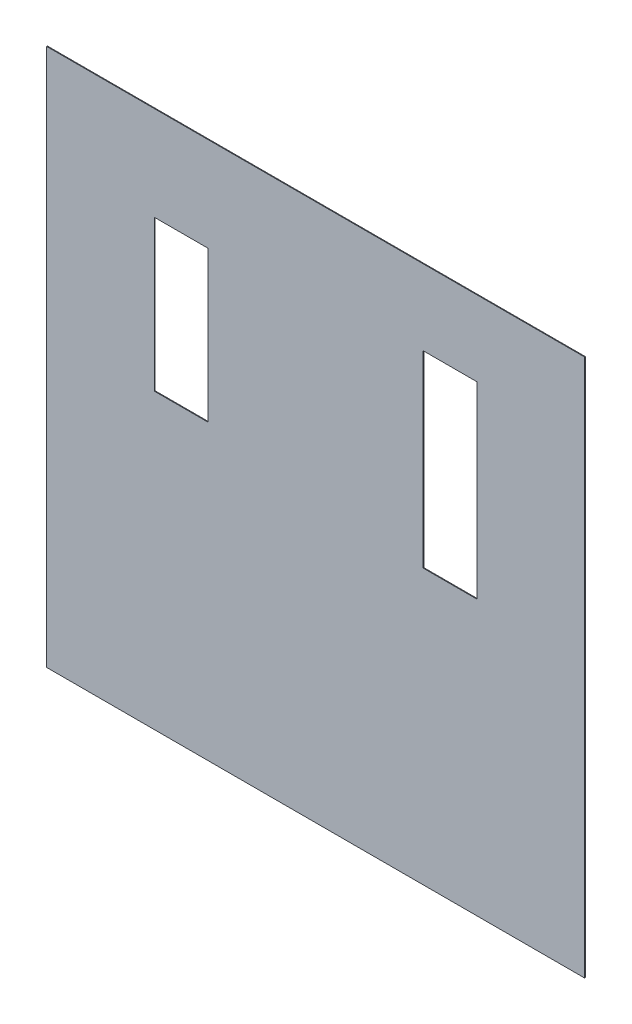
ISO-10303-21;
HEADER;
FILE_DESCRIPTION(('STEP AP214'),'2;1');
FILE_NAME('part.step','',(''),(''),'','','');
FILE_SCHEMA(('AUTOMOTIVE_DESIGN { 1 0 10303 214 1 1 1 1 }'));
ENDSEC;
DATA;
#1=APPLICATION_CONTEXT('core data for automotive mechanical design processes');
#2=APPLICATION_PROTOCOL_DEFINITION('international standard','automotive_design',2000,#1);
#3=PRODUCT_CONTEXT('',#1,'mechanical');
#4=PRODUCT('Part','Part','',(#3));
#5=PRODUCT_RELATED_PRODUCT_CATEGORY('part','',(#4));
#6=PRODUCT_DEFINITION_FORMATION('','',#4);
#7=PRODUCT_DEFINITION_CONTEXT('part definition',#1,'design');
#8=PRODUCT_DEFINITION('design','',#6,#7);
#9=PRODUCT_DEFINITION_SHAPE('','',#8);
#10=(LENGTH_UNIT() NAMED_UNIT(*) SI_UNIT(.MILLI.,.METRE.));
#11=(NAMED_UNIT(*) PLANE_ANGLE_UNIT() SI_UNIT($,.RADIAN.));
#12=(NAMED_UNIT(*) SI_UNIT($,.STERADIAN.) SOLID_ANGLE_UNIT());
#13=UNCERTAINTY_MEASURE_WITH_UNIT(LENGTH_MEASURE(1.E-05),#10,'distance_accuracy_value','');
#14=(GEOMETRIC_REPRESENTATION_CONTEXT(3) GLOBAL_UNCERTAINTY_ASSIGNED_CONTEXT((#13)) GLOBAL_UNIT_ASSIGNED_CONTEXT((#10,
#11,#12)) REPRESENTATION_CONTEXT('',''));
#15=CARTESIAN_POINT('',(0.,0.,0.));
#16=DIRECTION('',(0.,0.,1.));
#17=DIRECTION('',(1.,0.,0.));
#18=AXIS2_PLACEMENT_3D('',#15,#16,#17);
#19=CARTESIAN_POINT('',(0.,0.,0.03556));
#20=DIRECTION('',(1.,0.,0.));
#21=DIRECTION('',(0.,0.,-1.));
#22=AXIS2_PLACEMENT_3D('',#19,#20,#21);
#23=PLANE('',#22);
#24=DIRECTION('',(0.,-1.,0.));
#25=VECTOR('',#24,1.);
#26=CARTESIAN_POINT('',(0.,0.,0.));
#27=LINE('',#26,#25);
#28=CARTESIAN_POINT('',(0.,25.4,0.));
#29=VERTEX_POINT('',#28);
#30=CARTESIAN_POINT('',(0.,0.,0.));
#31=VERTEX_POINT('',#30);
#32=EDGE_CURVE('E183',#29,#31,#27,.T.);
#33=ORIENTED_EDGE('',*,*,#32,.T.);
#34=DIRECTION('',(0.,0.,-1.));
#35=VECTOR('',#34,1.);
#36=CARTESIAN_POINT('',(0.,0.,0.03556));
#37=LINE('',#36,#35);
#38=CARTESIAN_POINT('',(0.,0.,0.03556));
#39=VERTEX_POINT('',#38);
#40=EDGE_CURVE('E11',#39,#31,#37,.T.);
#41=ORIENTED_EDGE('',*,*,#40,.F.);
#42=DIRECTION('',(0.,-1.,0.));
#43=VECTOR('',#42,1.);
#44=CARTESIAN_POINT('',(0.,0.,0.03556));
#45=LINE('',#44,#43);
#46=CARTESIAN_POINT('',(0.,25.4,0.03556));
#47=VERTEX_POINT('',#46);
#48=EDGE_CURVE('E190',#47,#39,#45,.T.);
#49=ORIENTED_EDGE('',*,*,#48,.F.);
#50=DIRECTION('',(0.,0.,-1.));
#51=VECTOR('',#50,1.);
#52=CARTESIAN_POINT('',(0.,25.4,0.03556));
#53=LINE('',#52,#51);
#54=EDGE_CURVE('E200',#47,#29,#53,.T.);
#55=ORIENTED_EDGE('',*,*,#54,.T.);
#56=EDGE_LOOP('',(#33,#41,#49,#55));
#57=FACE_BOUND('',#56,.T.);
#58=ADVANCED_FACE('F33',(#57),#23,.F.);
#59=CARTESIAN_POINT('',(0.,0.,0.03556));
#60=DIRECTION('',(0.,1.,0.));
#61=DIRECTION('',(0.,0.,1.));
#62=AXIS2_PLACEMENT_3D('',#59,#60,#61);
#63=PLANE('',#62);
#64=DIRECTION('',(1.,0.,0.));
#65=VECTOR('',#64,1.);
#66=CARTESIAN_POINT('',(0.,0.,0.));
#67=LINE('',#66,#65);
#68=CARTESIAN_POINT('',(25.4,0.,0.));
#69=VERTEX_POINT('',#68);
#70=EDGE_CURVE('E203',#31,#69,#67,.T.);
#71=ORIENTED_EDGE('',*,*,#70,.T.);
#72=DIRECTION('',(0.,0.,-1.));
#73=VECTOR('',#72,1.);
#74=CARTESIAN_POINT('',(25.4,0.,0.03556));
#75=LINE('',#74,#73);
#76=CARTESIAN_POINT('',(25.4,0.,0.03556));
#77=VERTEX_POINT('',#76);
#78=EDGE_CURVE('E40',#77,#69,#75,.T.);
#79=ORIENTED_EDGE('',*,*,#78,.F.);
#80=DIRECTION('',(1.,0.,0.));
#81=VECTOR('',#80,1.);
#82=CARTESIAN_POINT('',(0.,0.,0.03556));
#83=LINE('',#82,#81);
#84=EDGE_CURVE('E193',#39,#77,#83,.T.);
#85=ORIENTED_EDGE('',*,*,#84,.F.);
#86=ORIENTED_EDGE('',*,*,#40,.T.);
#87=EDGE_LOOP('',(#71,#79,#85,#86));
#88=FACE_BOUND('',#87,.T.);
#89=ADVANCED_FACE('F232',(#88),#63,.F.);
#90=CARTESIAN_POINT('',(25.4,0.,0.03556));
#91=DIRECTION('',(-1.,0.,0.));
#92=DIRECTION('',(0.,0.,1.));
#93=AXIS2_PLACEMENT_3D('',#90,#91,#92);
#94=PLANE('',#93);
#95=DIRECTION('',(0.,1.,0.));
#96=VECTOR('',#95,1.);
#97=CARTESIAN_POINT('',(25.4,0.,0.));
#98=LINE('',#97,#96);
#99=CARTESIAN_POINT('',(25.4,25.4,0.));
#100=VERTEX_POINT('',#99);
#101=EDGE_CURVE('E205',#69,#100,#98,.T.);
#102=ORIENTED_EDGE('',*,*,#101,.T.);
#103=DIRECTION('',(0.,0.,-1.));
#104=VECTOR('',#103,1.);
#105=CARTESIAN_POINT('',(25.4,25.4,0.03556));
#106=LINE('',#105,#104);
#107=CARTESIAN_POINT('',(25.4,25.4,0.03556));
#108=VERTEX_POINT('',#107);
#109=EDGE_CURVE('E210',#108,#100,#106,.T.);
#110=ORIENTED_EDGE('',*,*,#109,.F.);
#111=DIRECTION('',(0.,1.,0.));
#112=VECTOR('',#111,1.);
#113=CARTESIAN_POINT('',(25.4,0.,0.03556));
#114=LINE('',#113,#112);
#115=EDGE_CURVE('E196',#77,#108,#114,.T.);
#116=ORIENTED_EDGE('',*,*,#115,.F.);
#117=ORIENTED_EDGE('',*,*,#78,.T.);
#118=EDGE_LOOP('',(#102,#110,#116,#117));
#119=FACE_BOUND('',#118,.T.);
#120=ADVANCED_FACE('F217',(#119),#94,.F.);
#121=CARTESIAN_POINT('',(0.,25.4,0.03556));
#122=DIRECTION('',(0.,-1.,0.));
#123=DIRECTION('',(0.,0.,-1.));
#124=AXIS2_PLACEMENT_3D('',#121,#122,#123);
#125=PLANE('',#124);
#126=DIRECTION('',(-1.,0.,0.));
#127=VECTOR('',#126,1.);
#128=CARTESIAN_POINT('',(0.,25.4,0.));
#129=LINE('',#128,#127);
#130=EDGE_CURVE('E194',#100,#29,#129,.T.);
#131=ORIENTED_EDGE('',*,*,#130,.T.);
#132=ORIENTED_EDGE('',*,*,#54,.F.);
#133=DIRECTION('',(-1.,0.,0.));
#134=VECTOR('',#133,1.);
#135=CARTESIAN_POINT('',(0.,25.4,0.03556));
#136=LINE('',#135,#134);
#137=EDGE_CURVE('E198',#108,#47,#136,.T.);
#138=ORIENTED_EDGE('',*,*,#137,.F.);
#139=ORIENTED_EDGE('',*,*,#109,.T.);
#140=EDGE_LOOP('',(#131,#132,#138,#139));
#141=FACE_BOUND('',#140,.T.);
#142=ADVANCED_FACE('F225',(#141),#125,.F.);
#143=CARTESIAN_POINT('',(0.,0.,0.03556));
#144=DIRECTION('',(0.,0.,-1.));
#145=DIRECTION('',(-1.,0.,0.));
#146=AXIS2_PLACEMENT_3D('',#143,#144,#145);
#147=PLANE('',#146);
#148=DIRECTION('',(1.,0.,0.));
#149=VECTOR('',#148,1.);
#150=CARTESIAN_POINT('',(17.78,12.954,0.03556));
#151=LINE('',#150,#149);
#152=CARTESIAN_POINT('',(17.78,12.954,0.03556));
#153=VERTEX_POINT('',#152);
#154=CARTESIAN_POINT('',(20.32,12.954,0.03556));
#155=VERTEX_POINT('',#154);
#156=EDGE_CURVE('E148',#153,#155,#151,.T.);
#157=ORIENTED_EDGE('',*,*,#156,.F.);
#158=DIRECTION('',(0.,-1.,0.));
#159=VECTOR('',#158,1.);
#160=CARTESIAN_POINT('',(17.78,21.844,0.03556));
#161=LINE('',#160,#159);
#162=CARTESIAN_POINT('',(17.78,21.844,0.03556));
#163=VERTEX_POINT('',#162);
#164=EDGE_CURVE('E47',#163,#153,#161,.T.);
#165=ORIENTED_EDGE('',*,*,#164,.F.);
#166=DIRECTION('',(-1.,0.,0.));
#167=VECTOR('',#166,1.);
#168=CARTESIAN_POINT('',(17.78,21.844,0.03556));
#169=LINE('',#168,#167);
#170=CARTESIAN_POINT('',(20.32,21.844,0.03556));
#171=VERTEX_POINT('',#170);
#172=EDGE_CURVE('E139',#171,#163,#169,.T.);
#173=ORIENTED_EDGE('',*,*,#172,.F.);
#174=DIRECTION('',(0.,1.,0.));
#175=VECTOR('',#174,1.);
#176=CARTESIAN_POINT('',(20.32,21.844,0.03556));
#177=LINE('',#176,#175);
#178=EDGE_CURVE('E142',#155,#171,#177,.T.);
#179=ORIENTED_EDGE('',*,*,#178,.F.);
#180=EDGE_LOOP('',(#157,#165,#173,#179));
#181=FACE_BOUND('',#180,.T.);
#182=DIRECTION('',(1.,0.,0.));
#183=VECTOR('',#182,1.);
#184=CARTESIAN_POINT('',(5.08,13.843,0.03556));
#185=LINE('',#184,#183);
#186=CARTESIAN_POINT('',(5.08,13.843,0.03556));
#187=VERTEX_POINT('',#186);
#188=CARTESIAN_POINT('',(7.62,13.843,0.03556));
#189=VERTEX_POINT('',#188);
#190=EDGE_CURVE('E173',#187,#189,#185,.T.);
#191=ORIENTED_EDGE('',*,*,#190,.F.);
#192=DIRECTION('',(0.,-1.,0.));
#193=VECTOR('',#192,1.);
#194=CARTESIAN_POINT('',(5.08,20.955,0.03556));
#195=LINE('',#194,#193);
#196=CARTESIAN_POINT('',(5.08,20.955,0.03556));
#197=VERTEX_POINT('',#196);
#198=EDGE_CURVE('E154',#197,#187,#195,.T.);
#199=ORIENTED_EDGE('',*,*,#198,.F.);
#200=DIRECTION('',(-1.,0.,0.));
#201=VECTOR('',#200,1.);
#202=CARTESIAN_POINT('',(5.08,20.955,0.03556));
#203=LINE('',#202,#201);
#204=CARTESIAN_POINT('',(7.62,20.955,0.03556));
#205=VERTEX_POINT('',#204);
#206=EDGE_CURVE('E162',#205,#197,#203,.T.);
#207=ORIENTED_EDGE('',*,*,#206,.F.);
#208=DIRECTION('',(0.,1.,0.));
#209=VECTOR('',#208,1.);
#210=CARTESIAN_POINT('',(7.62,20.955,0.03556));
#211=LINE('',#210,#209);
#212=EDGE_CURVE('E176',#189,#205,#211,.T.);
#213=ORIENTED_EDGE('',*,*,#212,.F.);
#214=EDGE_LOOP('',(#191,#199,#207,#213));
#215=FACE_BOUND('',#214,.T.);
#216=ORIENTED_EDGE('',*,*,#48,.T.);
#217=ORIENTED_EDGE('',*,*,#84,.T.);
#218=ORIENTED_EDGE('',*,*,#115,.T.);
#219=ORIENTED_EDGE('',*,*,#137,.T.);
#220=EDGE_LOOP('',(#216,#217,#218,#219));
#221=FACE_BOUND('',#220,.T.);
#222=ADVANCED_FACE('F231',(#181,#215,#221),#147,.F.);
#223=CARTESIAN_POINT('',(0.,0.,0.));
#224=DIRECTION('',(0.,0.,-1.));
#225=DIRECTION('',(-1.,0.,0.));
#226=AXIS2_PLACEMENT_3D('',#223,#224,#225);
#227=PLANE('',#226);
#228=DIRECTION('',(0.,-1.,0.));
#229=VECTOR('',#228,1.);
#230=CARTESIAN_POINT('',(17.78,21.844,0.));
#231=LINE('',#230,#229);
#232=CARTESIAN_POINT('',(17.78,21.844,0.));
#233=VERTEX_POINT('',#232);
#234=CARTESIAN_POINT('',(17.78,12.954,0.));
#235=VERTEX_POINT('',#234);
#236=EDGE_CURVE('E123',#233,#235,#231,.T.);
#237=ORIENTED_EDGE('',*,*,#236,.T.);
#238=DIRECTION('',(1.,0.,0.));
#239=VECTOR('',#238,1.);
#240=CARTESIAN_POINT('',(17.78,12.954,0.));
#241=LINE('',#240,#239);
#242=CARTESIAN_POINT('',(20.32,12.954,0.));
#243=VERTEX_POINT('',#242);
#244=EDGE_CURVE('E132',#235,#243,#241,.T.);
#245=ORIENTED_EDGE('',*,*,#244,.T.);
#246=DIRECTION('',(0.,1.,0.));
#247=VECTOR('',#246,1.);
#248=CARTESIAN_POINT('',(20.32,21.844,0.));
#249=LINE('',#248,#247);
#250=CARTESIAN_POINT('',(20.32,21.844,0.));
#251=VERTEX_POINT('',#250);
#252=EDGE_CURVE('E55',#243,#251,#249,.T.);
#253=ORIENTED_EDGE('',*,*,#252,.T.);
#254=DIRECTION('',(-1.,0.,0.));
#255=VECTOR('',#254,1.);
#256=CARTESIAN_POINT('',(17.78,21.844,0.));
#257=LINE('',#256,#255);
#258=EDGE_CURVE('E129',#251,#233,#257,.T.);
#259=ORIENTED_EDGE('',*,*,#258,.T.);
#260=EDGE_LOOP('',(#237,#245,#253,#259));
#261=FACE_BOUND('',#260,.T.);
#262=DIRECTION('',(0.,-1.,0.));
#263=VECTOR('',#262,1.);
#264=CARTESIAN_POINT('',(5.08,20.955,0.));
#265=LINE('',#264,#263);
#266=CARTESIAN_POINT('',(5.08,20.955,0.));
#267=VERTEX_POINT('',#266);
#268=CARTESIAN_POINT('',(5.08,13.843,0.));
#269=VERTEX_POINT('',#268);
#270=EDGE_CURVE('E158',#267,#269,#265,.T.);
#271=ORIENTED_EDGE('',*,*,#270,.T.);
#272=DIRECTION('',(1.,0.,0.));
#273=VECTOR('',#272,1.);
#274=CARTESIAN_POINT('',(5.08,13.843,0.));
#275=LINE('',#274,#273);
#276=CARTESIAN_POINT('',(7.62,13.843,0.));
#277=VERTEX_POINT('',#276);
#278=EDGE_CURVE('E161',#269,#277,#275,.T.);
#279=ORIENTED_EDGE('',*,*,#278,.T.);
#280=DIRECTION('',(0.,1.,0.));
#281=VECTOR('',#280,1.);
#282=CARTESIAN_POINT('',(7.62,20.955,0.));
#283=LINE('',#282,#281);
#284=CARTESIAN_POINT('',(7.62,20.955,0.));
#285=VERTEX_POINT('',#284);
#286=EDGE_CURVE('E165',#277,#285,#283,.T.);
#287=ORIENTED_EDGE('',*,*,#286,.T.);
#288=DIRECTION('',(-1.,0.,0.));
#289=VECTOR('',#288,1.);
#290=CARTESIAN_POINT('',(5.08,20.955,0.));
#291=LINE('',#290,#289);
#292=EDGE_CURVE('E168',#285,#267,#291,.T.);
#293=ORIENTED_EDGE('',*,*,#292,.T.);
#294=EDGE_LOOP('',(#271,#279,#287,#293));
#295=FACE_BOUND('',#294,.T.);
#296=ORIENTED_EDGE('',*,*,#32,.F.);
#297=ORIENTED_EDGE('',*,*,#130,.F.);
#298=ORIENTED_EDGE('',*,*,#101,.F.);
#299=ORIENTED_EDGE('',*,*,#70,.F.);
#300=EDGE_LOOP('',(#296,#297,#298,#299));
#301=FACE_BOUND('',#300,.T.);
#302=ADVANCED_FACE('F136',(#261,#295,#301),#227,.T.);
#303=CARTESIAN_POINT('',(5.08,20.955,0.));
#304=DIRECTION('',(-1.,0.,0.));
#305=DIRECTION('',(0.,-1.,0.));
#306=AXIS2_PLACEMENT_3D('',#303,#304,#305);
#307=PLANE('',#306);
#308=ORIENTED_EDGE('',*,*,#198,.T.);
#309=DIRECTION('',(0.,0.,1.));
#310=VECTOR('',#309,1.);
#311=CARTESIAN_POINT('',(5.08,13.843,0.));
#312=LINE('',#311,#310);
#313=EDGE_CURVE('E171',#269,#187,#312,.T.);
#314=ORIENTED_EDGE('',*,*,#313,.F.);
#315=ORIENTED_EDGE('',*,*,#270,.F.);
#316=DIRECTION('',(0.,0.,1.));
#317=VECTOR('',#316,1.);
#318=CARTESIAN_POINT('',(5.08,20.955,0.));
#319=LINE('',#318,#317);
#320=EDGE_CURVE('E181',#267,#197,#319,.T.);
#321=ORIENTED_EDGE('',*,*,#320,.T.);
#322=EDGE_LOOP('',(#308,#314,#315,#321));
#323=FACE_BOUND('',#322,.T.);
#324=ADVANCED_FACE('F244',(#323),#307,.F.);
#325=CARTESIAN_POINT('',(5.08,20.955,0.));
#326=DIRECTION('',(0.,1.,0.));
#327=DIRECTION('',(0.,0.,1.));
#328=AXIS2_PLACEMENT_3D('',#325,#326,#327);
#329=PLANE('',#328);
#330=ORIENTED_EDGE('',*,*,#206,.T.);
#331=ORIENTED_EDGE('',*,*,#320,.F.);
#332=ORIENTED_EDGE('',*,*,#292,.F.);
#333=DIRECTION('',(0.,0.,1.));
#334=VECTOR('',#333,1.);
#335=CARTESIAN_POINT('',(7.62,20.955,0.));
#336=LINE('',#335,#334);
#337=EDGE_CURVE('E184',#285,#205,#336,.T.);
#338=ORIENTED_EDGE('',*,*,#337,.T.);
#339=EDGE_LOOP('',(#330,#331,#332,#338));
#340=FACE_BOUND('',#339,.T.);
#341=ADVANCED_FACE('F250',(#340),#329,.F.);
#342=CARTESIAN_POINT('',(7.62,20.955,0.));
#343=DIRECTION('',(1.,0.,0.));
#344=DIRECTION('',(0.,1.,0.));
#345=AXIS2_PLACEMENT_3D('',#342,#343,#344);
#346=PLANE('',#345);
#347=ORIENTED_EDGE('',*,*,#212,.T.);
#348=ORIENTED_EDGE('',*,*,#337,.F.);
#349=ORIENTED_EDGE('',*,*,#286,.F.);
#350=DIRECTION('',(0.,0.,1.));
#351=VECTOR('',#350,1.);
#352=CARTESIAN_POINT('',(7.62,13.843,0.));
#353=LINE('',#352,#351);
#354=EDGE_CURVE('E186',#277,#189,#353,.T.);
#355=ORIENTED_EDGE('',*,*,#354,.T.);
#356=EDGE_LOOP('',(#347,#348,#349,#355));
#357=FACE_BOUND('',#356,.T.);
#358=ADVANCED_FACE('F255',(#357),#346,.F.);
#359=CARTESIAN_POINT('',(5.08,13.843,0.));
#360=DIRECTION('',(0.,-1.,0.));
#361=DIRECTION('',(0.,0.,-1.));
#362=AXIS2_PLACEMENT_3D('',#359,#360,#361);
#363=PLANE('',#362);
#364=ORIENTED_EDGE('',*,*,#190,.T.);
#365=ORIENTED_EDGE('',*,*,#354,.F.);
#366=ORIENTED_EDGE('',*,*,#278,.F.);
#367=ORIENTED_EDGE('',*,*,#313,.T.);
#368=EDGE_LOOP('',(#364,#365,#366,#367));
#369=FACE_BOUND('',#368,.T.);
#370=ADVANCED_FACE('F252',(#369),#363,.F.);
#371=CARTESIAN_POINT('',(17.78,21.844,0.));
#372=DIRECTION('',(-1.,0.,0.));
#373=DIRECTION('',(0.,-1.,0.));
#374=AXIS2_PLACEMENT_3D('',#371,#372,#373);
#375=PLANE('',#374);
#376=ORIENTED_EDGE('',*,*,#164,.T.);
#377=DIRECTION('',(0.,0.,1.));
#378=VECTOR('',#377,1.);
#379=CARTESIAN_POINT('',(17.78,12.954,0.));
#380=LINE('',#379,#378);
#381=EDGE_CURVE('E119',#235,#153,#380,.T.);
#382=ORIENTED_EDGE('',*,*,#381,.F.);
#383=ORIENTED_EDGE('',*,*,#236,.F.);
#384=DIRECTION('',(0.,0.,1.));
#385=VECTOR('',#384,1.);
#386=CARTESIAN_POINT('',(17.78,21.844,0.));
#387=LINE('',#386,#385);
#388=EDGE_CURVE('E152',#233,#163,#387,.T.);
#389=ORIENTED_EDGE('',*,*,#388,.T.);
#390=EDGE_LOOP('',(#376,#382,#383,#389));
#391=FACE_BOUND('',#390,.T.);
#392=ADVANCED_FACE('F121',(#391),#375,.F.);
#393=CARTESIAN_POINT('',(17.78,21.844,0.));
#394=DIRECTION('',(0.,1.,0.));
#395=DIRECTION('',(-1.,0.,0.));
#396=AXIS2_PLACEMENT_3D('',#393,#394,#395);
#397=PLANE('',#396);
#398=ORIENTED_EDGE('',*,*,#172,.T.);
#399=ORIENTED_EDGE('',*,*,#388,.F.);
#400=ORIENTED_EDGE('',*,*,#258,.F.);
#401=DIRECTION('',(0.,0.,1.));
#402=VECTOR('',#401,1.);
#403=CARTESIAN_POINT('',(20.32,21.844,0.));
#404=LINE('',#403,#402);
#405=EDGE_CURVE('E155',#251,#171,#404,.T.);
#406=ORIENTED_EDGE('',*,*,#405,.T.);
#407=EDGE_LOOP('',(#398,#399,#400,#406));
#408=FACE_BOUND('',#407,.T.);
#409=ADVANCED_FACE('F265',(#408),#397,.F.);
#410=CARTESIAN_POINT('',(20.32,21.844,0.));
#411=DIRECTION('',(1.,0.,0.));
#412=DIRECTION('',(0.,0.,-1.));
#413=AXIS2_PLACEMENT_3D('',#410,#411,#412);
#414=PLANE('',#413);
#415=ORIENTED_EDGE('',*,*,#178,.T.);
#416=ORIENTED_EDGE('',*,*,#405,.F.);
#417=ORIENTED_EDGE('',*,*,#252,.F.);
#418=DIRECTION('',(0.,0.,1.));
#419=VECTOR('',#418,1.);
#420=CARTESIAN_POINT('',(20.32,12.954,0.));
#421=LINE('',#420,#419);
#422=EDGE_CURVE('E128',#243,#155,#421,.T.);
#423=ORIENTED_EDGE('',*,*,#422,.T.);
#424=EDGE_LOOP('',(#415,#416,#417,#423));
#425=FACE_BOUND('',#424,.T.);
#426=ADVANCED_FACE('F268',(#425),#414,.F.);
#427=CARTESIAN_POINT('',(17.78,12.954,0.));
#428=DIRECTION('',(0.,-1.,0.));
#429=DIRECTION('',(1.,0.,0.));
#430=AXIS2_PLACEMENT_3D('',#427,#428,#429);
#431=PLANE('',#430);
#432=ORIENTED_EDGE('',*,*,#156,.T.);
#433=ORIENTED_EDGE('',*,*,#422,.F.);
#434=ORIENTED_EDGE('',*,*,#244,.F.);
#435=ORIENTED_EDGE('',*,*,#381,.T.);
#436=EDGE_LOOP('',(#432,#433,#434,#435));
#437=FACE_BOUND('',#436,.T.);
#438=ADVANCED_FACE('F133',(#437),#431,.F.);
#439=CLOSED_SHELL('',(#58,#89,#120,#142,#222,#302,#324,#341,#358,#370,#392,#409,#426,#438));
#440=MANIFOLD_SOLID_BREP('B2',#439);
#441=ADVANCED_BREP_SHAPE_REPRESENTATION('',(#18,#440),#14);
#442=SHAPE_DEFINITION_REPRESENTATION(#9,#441);
ENDSEC;
END-ISO-10303-21;
